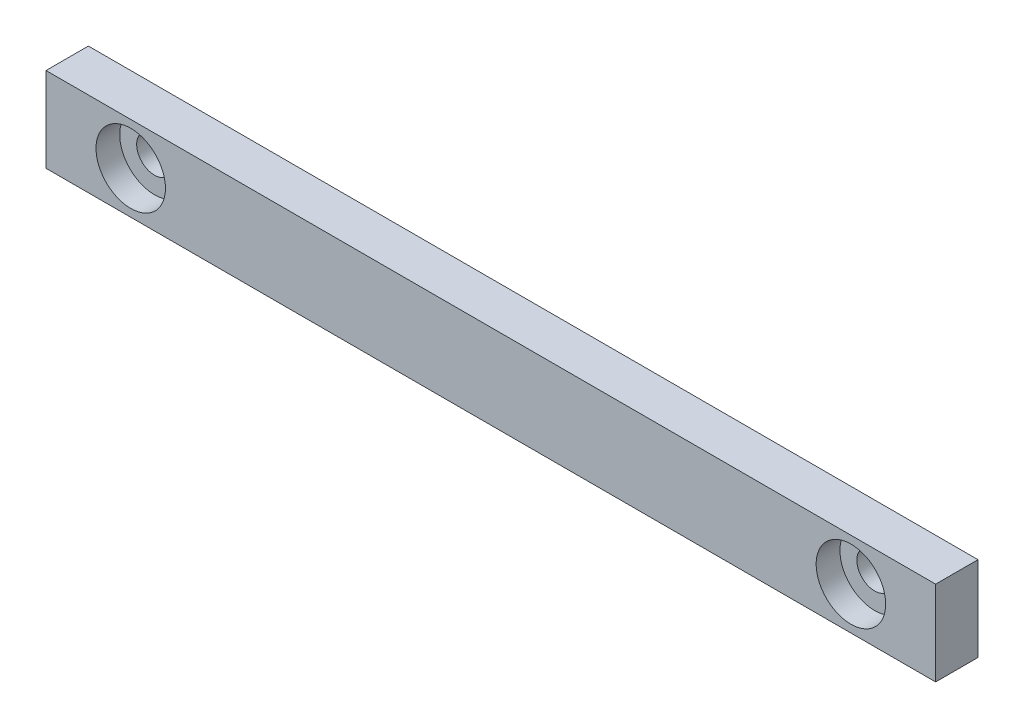
ISO-10303-21;
HEADER;
FILE_DESCRIPTION(('STEP AP214'),'2;1');
FILE_NAME('part.step','',(''),(''),'','','');
FILE_SCHEMA(('AUTOMOTIVE_DESIGN { 1 0 10303 214 1 1 1 1 }'));
ENDSEC;
DATA;
#1=APPLICATION_CONTEXT('core data for automotive mechanical design processes');
#2=APPLICATION_PROTOCOL_DEFINITION('international standard','automotive_design',2000,#1);
#3=PRODUCT_CONTEXT('',#1,'mechanical');
#4=PRODUCT('Part','Part','',(#3));
#5=PRODUCT_RELATED_PRODUCT_CATEGORY('part','',(#4));
#6=PRODUCT_DEFINITION_FORMATION('','',#4);
#7=PRODUCT_DEFINITION_CONTEXT('part definition',#1,'design');
#8=PRODUCT_DEFINITION('design','',#6,#7);
#9=PRODUCT_DEFINITION_SHAPE('','',#8);
#10=(LENGTH_UNIT() NAMED_UNIT(*) SI_UNIT(.MILLI.,.METRE.));
#11=(NAMED_UNIT(*) PLANE_ANGLE_UNIT() SI_UNIT($,.RADIAN.));
#12=(NAMED_UNIT(*) SI_UNIT($,.STERADIAN.) SOLID_ANGLE_UNIT());
#13=UNCERTAINTY_MEASURE_WITH_UNIT(LENGTH_MEASURE(1.E-05),#10,'distance_accuracy_value','');
#14=(GEOMETRIC_REPRESENTATION_CONTEXT(3) GLOBAL_UNCERTAINTY_ASSIGNED_CONTEXT((#13)) GLOBAL_UNIT_ASSIGNED_CONTEXT((#10,
#11,#12)) REPRESENTATION_CONTEXT('',''));
#15=CARTESIAN_POINT('',(0.,0.,0.));
#16=DIRECTION('',(0.,0.,1.));
#17=DIRECTION('',(1.,0.,0.));
#18=AXIS2_PLACEMENT_3D('',#15,#16,#17);
#19=CARTESIAN_POINT('',(-38.6775631500743,4.907132243685,5.));
#20=DIRECTION('',(0.,0.,-1.));
#21=DIRECTION('',(-1.,0.,0.));
#22=AXIS2_PLACEMENT_3D('',#19,#20,#21);
#23=CYLINDRICAL_SURFACE('',#22,2.1);
#24=CARTESIAN_POINT('',(-38.6775631500743,4.907132243685,0.));
#25=DIRECTION('',(0.,0.,1.));
#26=DIRECTION('',(1.,0.,0.));
#27=AXIS2_PLACEMENT_3D('',#24,#25,#26);
#28=CIRCLE('',#27,2.1);
#29=CARTESIAN_POINT('',(-36.5775631500743,4.907132243685,0.));
#30=VERTEX_POINT('',#29);
#31=EDGE_CURVE('E132',#30,#30,#28,.T.);
#32=ORIENTED_EDGE('',*,*,#31,.F.);
#33=EDGE_LOOP('',(#32));
#34=FACE_BOUND('',#33,.T.);
#35=CARTESIAN_POINT('',(-38.6775631500743,4.907132243685,2.2));
#36=DIRECTION('',(0.,0.,1.));
#37=DIRECTION('',(1.,0.,0.));
#38=AXIS2_PLACEMENT_3D('',#35,#36,#37);
#39=CIRCLE('',#38,2.1);
#40=CARTESIAN_POINT('',(-36.5775631500743,4.907132243685,2.2));
#41=VERTEX_POINT('',#40);
#42=EDGE_CURVE('E67',#41,#41,#39,.T.);
#43=ORIENTED_EDGE('',*,*,#42,.T.);
#44=EDGE_LOOP('',(#43));
#45=FACE_BOUND('',#44,.T.);
#46=ADVANCED_FACE('F63',(#34,#45),#23,.F.);
#47=CARTESIAN_POINT('',(46.3224368499257,4.907132243685,5.));
#48=DIRECTION('',(0.,0.,-1.));
#49=DIRECTION('',(-1.,0.,0.));
#50=AXIS2_PLACEMENT_3D('',#47,#48,#49);
#51=CYLINDRICAL_SURFACE('',#50,2.1);
#52=CARTESIAN_POINT('',(46.3224368499257,4.907132243685,0.));
#53=DIRECTION('',(0.,0.,1.));
#54=DIRECTION('',(1.,0.,0.));
#55=AXIS2_PLACEMENT_3D('',#52,#53,#54);
#56=CIRCLE('',#55,2.1);
#57=CARTESIAN_POINT('',(48.4224368499257,4.907132243685,0.));
#58=VERTEX_POINT('',#57);
#59=EDGE_CURVE('E146',#58,#58,#56,.T.);
#60=ORIENTED_EDGE('',*,*,#59,.F.);
#61=EDGE_LOOP('',(#60));
#62=FACE_BOUND('',#61,.T.);
#63=CARTESIAN_POINT('',(46.3224368499257,4.907132243685,2.2));
#64=DIRECTION('',(0.,0.,1.));
#65=DIRECTION('',(1.,0.,0.));
#66=AXIS2_PLACEMENT_3D('',#63,#64,#65);
#67=CIRCLE('',#66,2.1);
#68=CARTESIAN_POINT('',(48.4224368499257,4.907132243685,2.2));
#69=VERTEX_POINT('',#68);
#70=EDGE_CURVE('E140',#69,#69,#67,.T.);
#71=ORIENTED_EDGE('',*,*,#70,.T.);
#72=EDGE_LOOP('',(#71));
#73=FACE_BOUND('',#72,.T.);
#74=ADVANCED_FACE('F171',(#62,#73),#51,.F.);
#75=CARTESIAN_POINT('',(0.,0.,5.));
#76=DIRECTION('',(0.,0.,1.));
#77=DIRECTION('',(1.,0.,0.));
#78=AXIS2_PLACEMENT_3D('',#75,#76,#77);
#79=PLANE('',#78);
#80=CARTESIAN_POINT('',(-38.6775631500743,4.907132243685,5.));
#81=DIRECTION('',(0.,0.,1.));
#82=DIRECTION('',(1.,0.,0.));
#83=AXIS2_PLACEMENT_3D('',#80,#81,#82);
#84=CIRCLE('',#83,4.1);
#85=CARTESIAN_POINT('',(-34.5775631500743,4.907132243685,5.));
#86=VERTEX_POINT('',#85);
#87=EDGE_CURVE('E148',#86,#86,#84,.T.);
#88=ORIENTED_EDGE('',*,*,#87,.F.);
#89=EDGE_LOOP('',(#88));
#90=FACE_BOUND('',#89,.T.);
#91=CARTESIAN_POINT('',(46.3224368499257,4.907132243685,5.));
#92=DIRECTION('',(0.,0.,1.));
#93=DIRECTION('',(1.,0.,0.));
#94=AXIS2_PLACEMENT_3D('',#91,#92,#93);
#95=CIRCLE('',#94,4.1);
#96=CARTESIAN_POINT('',(50.4224368499257,4.907132243685,5.));
#97=VERTEX_POINT('',#96);
#98=EDGE_CURVE('E158',#97,#97,#95,.T.);
#99=ORIENTED_EDGE('',*,*,#98,.F.);
#100=EDGE_LOOP('',(#99));
#101=FACE_BOUND('',#100,.T.);
#102=DIRECTION('',(0.,-1.,0.));
#103=VECTOR('',#102,1.);
#104=CARTESIAN_POINT('',(-48.6775631500743,9.907132243685,5.));
#105=LINE('',#104,#103);
#106=CARTESIAN_POINT('',(-48.6775631500743,9.907132243685,5.));
#107=VERTEX_POINT('',#106);
#108=CARTESIAN_POINT('',(-48.6775631500743,-0.0928677563149984,5.));
#109=VERTEX_POINT('',#108);
#110=EDGE_CURVE('E115',#107,#109,#105,.T.);
#111=ORIENTED_EDGE('',*,*,#110,.T.);
#112=DIRECTION('',(1.,0.,0.));
#113=VECTOR('',#112,1.);
#114=CARTESIAN_POINT('',(-48.6775631500743,-0.0928677563149984,5.));
#115=LINE('',#114,#113);
#116=CARTESIAN_POINT('',(56.3224368499257,-0.0928677563149984,5.));
#117=VERTEX_POINT('',#116);
#118=EDGE_CURVE('E107',#109,#117,#115,.T.);
#119=ORIENTED_EDGE('',*,*,#118,.T.);
#120=DIRECTION('',(0.,-1.,0.));
#121=VECTOR('',#120,1.);
#122=CARTESIAN_POINT('',(56.3224368499257,9.907132243685,5.));
#123=LINE('',#122,#121);
#124=CARTESIAN_POINT('',(56.3224368499257,9.907132243685,5.));
#125=VERTEX_POINT('',#124);
#126=EDGE_CURVE('E114',#125,#117,#123,.T.);
#127=ORIENTED_EDGE('',*,*,#126,.F.);
#128=DIRECTION('',(1.,0.,0.));
#129=VECTOR('',#128,1.);
#130=CARTESIAN_POINT('',(-48.6775631500743,9.907132243685,5.));
#131=LINE('',#130,#129);
#132=EDGE_CURVE('E125',#107,#125,#131,.T.);
#133=ORIENTED_EDGE('',*,*,#132,.F.);
#134=EDGE_LOOP('',(#111,#119,#127,#133));
#135=FACE_BOUND('',#134,.T.);
#136=ADVANCED_FACE('F111',(#90,#101,#135),#79,.T.);
#137=CARTESIAN_POINT('',(0.,0.,0.));
#138=DIRECTION('',(0.,0.,1.));
#139=DIRECTION('',(1.,0.,0.));
#140=AXIS2_PLACEMENT_3D('',#137,#138,#139);
#141=PLANE('',#140);
#142=DIRECTION('',(0.,-1.,0.));
#143=VECTOR('',#142,1.);
#144=CARTESIAN_POINT('',(-48.6775631500743,9.907132243685,0.));
#145=LINE('',#144,#143);
#146=CARTESIAN_POINT('',(-48.6775631500743,9.907132243685,0.));
#147=VERTEX_POINT('',#146);
#148=CARTESIAN_POINT('',(-48.6775631500743,-0.0928677563149984,0.));
#149=VERTEX_POINT('',#148);
#150=EDGE_CURVE('E130',#147,#149,#145,.T.);
#151=ORIENTED_EDGE('',*,*,#150,.F.);
#152=DIRECTION('',(1.,0.,0.));
#153=VECTOR('',#152,1.);
#154=CARTESIAN_POINT('',(-48.6775631500743,9.907132243685,0.));
#155=LINE('',#154,#153);
#156=CARTESIAN_POINT('',(56.3224368499257,9.907132243685,0.));
#157=VERTEX_POINT('',#156);
#158=EDGE_CURVE('E136',#147,#157,#155,.T.);
#159=ORIENTED_EDGE('',*,*,#158,.T.);
#160=DIRECTION('',(0.,-1.,0.));
#161=VECTOR('',#160,1.);
#162=CARTESIAN_POINT('',(56.3224368499257,9.907132243685,0.));
#163=LINE('',#162,#161);
#164=CARTESIAN_POINT('',(56.3224368499257,-0.0928677563149984,0.));
#165=VERTEX_POINT('',#164);
#166=EDGE_CURVE('E134',#157,#165,#163,.T.);
#167=ORIENTED_EDGE('',*,*,#166,.T.);
#168=DIRECTION('',(1.,0.,0.));
#169=VECTOR('',#168,1.);
#170=CARTESIAN_POINT('',(-48.6775631500743,-0.0928677563149984,0.));
#171=LINE('',#170,#169);
#172=EDGE_CURVE('E120',#149,#165,#171,.T.);
#173=ORIENTED_EDGE('',*,*,#172,.F.);
#174=EDGE_LOOP('',(#151,#159,#167,#173));
#175=FACE_BOUND('',#174,.T.);
#176=ORIENTED_EDGE('',*,*,#31,.T.);
#177=EDGE_LOOP('',(#176));
#178=FACE_BOUND('',#177,.T.);
#179=ORIENTED_EDGE('',*,*,#59,.T.);
#180=EDGE_LOOP('',(#179));
#181=FACE_BOUND('',#180,.T.);
#182=ADVANCED_FACE('F166',(#175,#178,#181),#141,.F.);
#183=CARTESIAN_POINT('',(-48.6775631500743,9.907132243685,5.));
#184=DIRECTION('',(1.,0.,0.));
#185=DIRECTION('',(0.,0.,-1.));
#186=AXIS2_PLACEMENT_3D('',#183,#184,#185);
#187=PLANE('',#186);
#188=ORIENTED_EDGE('',*,*,#150,.T.);
#189=DIRECTION('',(0.,0.,-1.));
#190=VECTOR('',#189,1.);
#191=CARTESIAN_POINT('',(-48.6775631500743,-0.0928677563149984,5.));
#192=LINE('',#191,#190);
#193=EDGE_CURVE('E12',#109,#149,#192,.T.);
#194=ORIENTED_EDGE('',*,*,#193,.F.);
#195=ORIENTED_EDGE('',*,*,#110,.F.);
#196=DIRECTION('',(0.,0.,-1.));
#197=VECTOR('',#196,1.);
#198=CARTESIAN_POINT('',(-48.6775631500743,9.907132243685,5.));
#199=LINE('',#198,#197);
#200=EDGE_CURVE('E82',#107,#147,#199,.T.);
#201=ORIENTED_EDGE('',*,*,#200,.T.);
#202=EDGE_LOOP('',(#188,#194,#195,#201));
#203=FACE_BOUND('',#202,.T.);
#204=ADVANCED_FACE('F65',(#203),#187,.F.);
#205=CARTESIAN_POINT('',(-48.6775631500743,-0.0928677563149984,5.));
#206=DIRECTION('',(0.,1.,0.));
#207=DIRECTION('',(0.,0.,1.));
#208=AXIS2_PLACEMENT_3D('',#205,#206,#207);
#209=PLANE('',#208);
#210=ORIENTED_EDGE('',*,*,#172,.T.);
#211=DIRECTION('',(0.,0.,-1.));
#212=VECTOR('',#211,1.);
#213=CARTESIAN_POINT('',(56.3224368499257,-0.0928677563149984,5.));
#214=LINE('',#213,#212);
#215=EDGE_CURVE('E73',#117,#165,#214,.T.);
#216=ORIENTED_EDGE('',*,*,#215,.F.);
#217=ORIENTED_EDGE('',*,*,#118,.F.);
#218=ORIENTED_EDGE('',*,*,#193,.T.);
#219=EDGE_LOOP('',(#210,#216,#217,#218));
#220=FACE_BOUND('',#219,.T.);
#221=ADVANCED_FACE('F119',(#220),#209,.F.);
#222=CARTESIAN_POINT('',(56.3224368499257,9.907132243685,5.));
#223=DIRECTION('',(1.,0.,0.));
#224=DIRECTION('',(0.,0.,-1.));
#225=AXIS2_PLACEMENT_3D('',#222,#223,#224);
#226=PLANE('',#225);
#227=ORIENTED_EDGE('',*,*,#166,.F.);
#228=DIRECTION('',(0.,0.,-1.));
#229=VECTOR('',#228,1.);
#230=CARTESIAN_POINT('',(56.3224368499257,9.907132243685,5.));
#231=LINE('',#230,#229);
#232=EDGE_CURVE('E96',#125,#157,#231,.T.);
#233=ORIENTED_EDGE('',*,*,#232,.F.);
#234=ORIENTED_EDGE('',*,*,#126,.T.);
#235=ORIENTED_EDGE('',*,*,#215,.T.);
#236=EDGE_LOOP('',(#227,#233,#234,#235));
#237=FACE_BOUND('',#236,.T.);
#238=ADVANCED_FACE('F124',(#237),#226,.T.);
#239=CARTESIAN_POINT('',(-48.6775631500743,9.907132243685,5.));
#240=DIRECTION('',(0.,1.,0.));
#241=DIRECTION('',(0.,0.,1.));
#242=AXIS2_PLACEMENT_3D('',#239,#240,#241);
#243=PLANE('',#242);
#244=ORIENTED_EDGE('',*,*,#158,.F.);
#245=ORIENTED_EDGE('',*,*,#200,.F.);
#246=ORIENTED_EDGE('',*,*,#132,.T.);
#247=ORIENTED_EDGE('',*,*,#232,.T.);
#248=EDGE_LOOP('',(#244,#245,#246,#247));
#249=FACE_BOUND('',#248,.T.);
#250=ADVANCED_FACE('F192',(#249),#243,.T.);
#251=CARTESIAN_POINT('',(46.3224368499257,4.907132243685,2.2));
#252=DIRECTION('',(0.,0.,1.));
#253=DIRECTION('',(1.,0.,0.));
#254=AXIS2_PLACEMENT_3D('',#251,#252,#253);
#255=CYLINDRICAL_SURFACE('',#254,4.1);
#256=CARTESIAN_POINT('',(46.3224368499257,4.907132243685,2.2));
#257=DIRECTION('',(0.,0.,1.));
#258=DIRECTION('',(1.,0.,0.));
#259=AXIS2_PLACEMENT_3D('',#256,#257,#258);
#260=CIRCLE('',#259,4.1);
#261=CARTESIAN_POINT('',(50.4224368499257,4.907132243685,2.2));
#262=VERTEX_POINT('',#261);
#263=EDGE_CURVE('E153',#262,#262,#260,.T.);
#264=ORIENTED_EDGE('',*,*,#263,.F.);
#265=EDGE_LOOP('',(#264));
#266=FACE_BOUND('',#265,.T.);
#267=ORIENTED_EDGE('',*,*,#98,.T.);
#268=EDGE_LOOP('',(#267));
#269=FACE_BOUND('',#268,.T.);
#270=ADVANCED_FACE('F188',(#266,#269),#255,.F.);
#271=CARTESIAN_POINT('',(46.3224368499257,4.907132243685,2.2));
#272=DIRECTION('',(0.,0.,1.));
#273=DIRECTION('',(1.,0.,0.));
#274=AXIS2_PLACEMENT_3D('',#271,#272,#273);
#275=PLANE('',#274);
#276=ORIENTED_EDGE('',*,*,#70,.F.);
#277=EDGE_LOOP('',(#276));
#278=FACE_BOUND('',#277,.T.);
#279=ORIENTED_EDGE('',*,*,#263,.T.);
#280=EDGE_LOOP('',(#279));
#281=FACE_BOUND('',#280,.T.);
#282=ADVANCED_FACE('F182',(#278,#281),#275,.T.);
#283=CARTESIAN_POINT('',(-38.6775631500743,4.907132243685,2.2));
#284=DIRECTION('',(0.,0.,1.));
#285=DIRECTION('',(1.,0.,0.));
#286=AXIS2_PLACEMENT_3D('',#283,#284,#285);
#287=CYLINDRICAL_SURFACE('',#286,4.1);
#288=CARTESIAN_POINT('',(-38.6775631500743,4.907132243685,2.2));
#289=DIRECTION('',(0.,0.,1.));
#290=DIRECTION('',(1.,0.,0.));
#291=AXIS2_PLACEMENT_3D('',#288,#289,#290);
#292=CIRCLE('',#291,4.1);
#293=CARTESIAN_POINT('',(-34.5775631500743,4.907132243685,2.2));
#294=VERTEX_POINT('',#293);
#295=EDGE_CURVE('E142',#294,#294,#292,.T.);
#296=ORIENTED_EDGE('',*,*,#295,.F.);
#297=EDGE_LOOP('',(#296));
#298=FACE_BOUND('',#297,.T.);
#299=ORIENTED_EDGE('',*,*,#87,.T.);
#300=EDGE_LOOP('',(#299));
#301=FACE_BOUND('',#300,.T.);
#302=ADVANCED_FACE('F177',(#298,#301),#287,.F.);
#303=CARTESIAN_POINT('',(-38.6775631500743,4.907132243685,2.2));
#304=DIRECTION('',(0.,0.,1.));
#305=DIRECTION('',(1.,0.,0.));
#306=AXIS2_PLACEMENT_3D('',#303,#304,#305);
#307=PLANE('',#306);
#308=ORIENTED_EDGE('',*,*,#42,.F.);
#309=EDGE_LOOP('',(#308));
#310=FACE_BOUND('',#309,.T.);
#311=ORIENTED_EDGE('',*,*,#295,.T.);
#312=EDGE_LOOP('',(#311));
#313=FACE_BOUND('',#312,.T.);
#314=ADVANCED_FACE('F175',(#310,#313),#307,.T.);
#315=CLOSED_SHELL('',(#46,#74,#136,#182,#204,#221,#238,#250,#270,#282,#302,#314));
#316=MANIFOLD_SOLID_BREP('B2',#315);
#317=ADVANCED_BREP_SHAPE_REPRESENTATION('',(#18,#316),#14);
#318=SHAPE_DEFINITION_REPRESENTATION(#9,#317);
ENDSEC;
END-ISO-10303-21;
